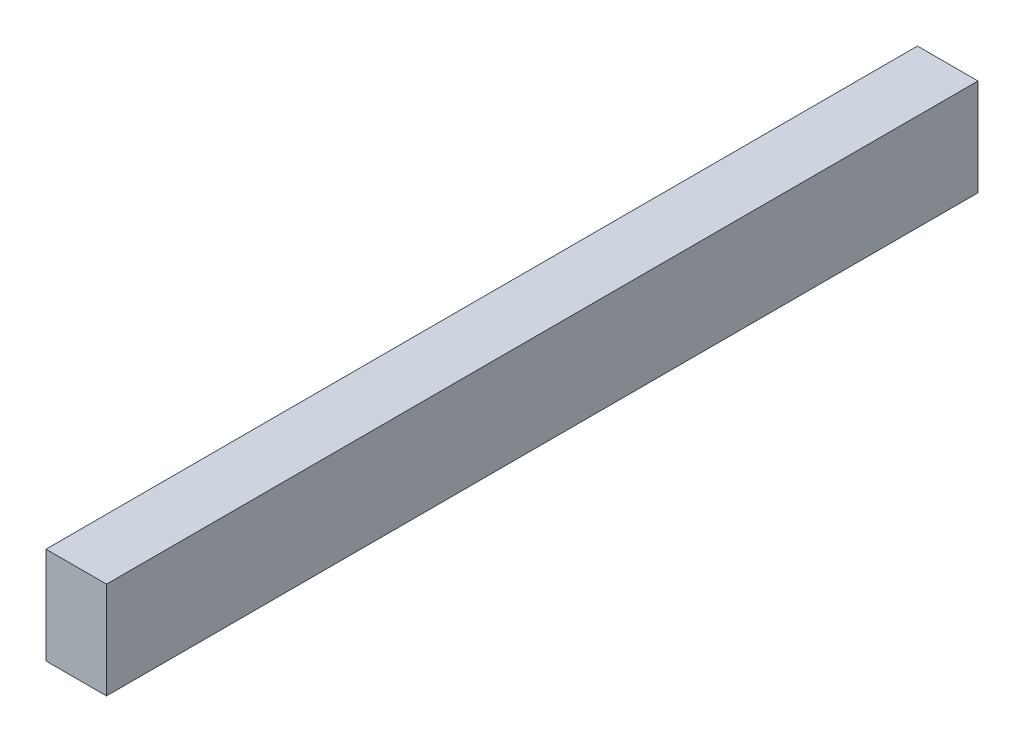
ISO-10303-21;
HEADER;
FILE_DESCRIPTION(('STEP AP214'),'2;1');
FILE_NAME('part.step','',(''),(''),'','','');
FILE_SCHEMA(('AUTOMOTIVE_DESIGN { 1 0 10303 214 1 1 1 1 }'));
ENDSEC;
DATA;
#1=APPLICATION_CONTEXT('core data for automotive mechanical design processes');
#2=APPLICATION_PROTOCOL_DEFINITION('international standard','automotive_design',2000,#1);
#3=PRODUCT_CONTEXT('',#1,'mechanical');
#4=PRODUCT('Part','Part','',(#3));
#5=PRODUCT_RELATED_PRODUCT_CATEGORY('part','',(#4));
#6=PRODUCT_DEFINITION_FORMATION('','',#4);
#7=PRODUCT_DEFINITION_CONTEXT('part definition',#1,'design');
#8=PRODUCT_DEFINITION('design','',#6,#7);
#9=PRODUCT_DEFINITION_SHAPE('','',#8);
#10=(LENGTH_UNIT() NAMED_UNIT(*) SI_UNIT(.MILLI.,.METRE.));
#11=(NAMED_UNIT(*) PLANE_ANGLE_UNIT() SI_UNIT($,.RADIAN.));
#12=(NAMED_UNIT(*) SI_UNIT($,.STERADIAN.) SOLID_ANGLE_UNIT());
#13=UNCERTAINTY_MEASURE_WITH_UNIT(LENGTH_MEASURE(1.E-05),#10,'distance_accuracy_value','');
#14=(GEOMETRIC_REPRESENTATION_CONTEXT(3) GLOBAL_UNCERTAINTY_ASSIGNED_CONTEXT((#13)) GLOBAL_UNIT_ASSIGNED_CONTEXT((#10,
#11,#12)) REPRESENTATION_CONTEXT('',''));
#15=CARTESIAN_POINT('',(0.,0.,0.));
#16=DIRECTION('',(0.,0.,1.));
#17=DIRECTION('',(1.,0.,0.));
#18=AXIS2_PLACEMENT_3D('',#15,#16,#17);
#19=CARTESIAN_POINT('',(0.,0.,360.));
#20=DIRECTION('',(1.,0.,0.));
#21=DIRECTION('',(0.,0.,-1.));
#22=AXIS2_PLACEMENT_3D('',#19,#20,#21);
#23=PLANE('',#22);
#24=DIRECTION('',(0.,-1.,0.));
#25=VECTOR('',#24,1.);
#26=CARTESIAN_POINT('',(0.,0.,0.));
#27=LINE('',#26,#25);
#28=CARTESIAN_POINT('',(0.,40.,0.));
#29=VERTEX_POINT('',#28);
#30=CARTESIAN_POINT('',(0.,0.,0.));
#31=VERTEX_POINT('',#30);
#32=EDGE_CURVE('E96',#29,#31,#27,.T.);
#33=ORIENTED_EDGE('',*,*,#32,.T.);
#34=DIRECTION('',(0.,0.,-1.));
#35=VECTOR('',#34,1.);
#36=CARTESIAN_POINT('',(0.,0.,360.));
#37=LINE('',#36,#35);
#38=CARTESIAN_POINT('',(0.,0.,360.));
#39=VERTEX_POINT('',#38);
#40=EDGE_CURVE('E11',#39,#31,#37,.T.);
#41=ORIENTED_EDGE('',*,*,#40,.F.);
#42=DIRECTION('',(0.,-1.,0.));
#43=VECTOR('',#42,1.);
#44=CARTESIAN_POINT('',(0.,0.,360.));
#45=LINE('',#44,#43);
#46=CARTESIAN_POINT('',(0.,40.,360.));
#47=VERTEX_POINT('',#46);
#48=EDGE_CURVE('E84',#47,#39,#45,.T.);
#49=ORIENTED_EDGE('',*,*,#48,.F.);
#50=DIRECTION('',(0.,0.,-1.));
#51=VECTOR('',#50,1.);
#52=CARTESIAN_POINT('',(0.,40.,360.));
#53=LINE('',#52,#51);
#54=EDGE_CURVE('E92',#47,#29,#53,.T.);
#55=ORIENTED_EDGE('',*,*,#54,.T.);
#56=EDGE_LOOP('',(#33,#41,#49,#55));
#57=FACE_BOUND('',#56,.T.);
#58=ADVANCED_FACE('F33',(#57),#23,.F.);
#59=CARTESIAN_POINT('',(0.,0.,360.));
#60=DIRECTION('',(0.,1.,0.));
#61=DIRECTION('',(0.,0.,1.));
#62=AXIS2_PLACEMENT_3D('',#59,#60,#61);
#63=PLANE('',#62);
#64=DIRECTION('',(1.,0.,0.));
#65=VECTOR('',#64,1.);
#66=CARTESIAN_POINT('',(0.,0.,0.));
#67=LINE('',#66,#65);
#68=CARTESIAN_POINT('',(25.,0.,0.));
#69=VERTEX_POINT('',#68);
#70=EDGE_CURVE('E88',#31,#69,#67,.T.);
#71=ORIENTED_EDGE('',*,*,#70,.T.);
#72=DIRECTION('',(0.,0.,-1.));
#73=VECTOR('',#72,1.);
#74=CARTESIAN_POINT('',(25.,0.,360.));
#75=LINE('',#74,#73);
#76=CARTESIAN_POINT('',(25.,0.,360.));
#77=VERTEX_POINT('',#76);
#78=EDGE_CURVE('E41',#77,#69,#75,.T.);
#79=ORIENTED_EDGE('',*,*,#78,.F.);
#80=DIRECTION('',(1.,0.,0.));
#81=VECTOR('',#80,1.);
#82=CARTESIAN_POINT('',(0.,0.,360.));
#83=LINE('',#82,#81);
#84=EDGE_CURVE('E79',#39,#77,#83,.T.);
#85=ORIENTED_EDGE('',*,*,#84,.F.);
#86=ORIENTED_EDGE('',*,*,#40,.T.);
#87=EDGE_LOOP('',(#71,#79,#85,#86));
#88=FACE_BOUND('',#87,.T.);
#89=ADVANCED_FACE('F87',(#88),#63,.F.);
#90=CARTESIAN_POINT('',(25.,0.,360.));
#91=DIRECTION('',(-1.,0.,0.));
#92=DIRECTION('',(0.,0.,1.));
#93=AXIS2_PLACEMENT_3D('',#90,#91,#92);
#94=PLANE('',#93);
#95=DIRECTION('',(0.,1.,0.));
#96=VECTOR('',#95,1.);
#97=CARTESIAN_POINT('',(25.,0.,0.));
#98=LINE('',#97,#96);
#99=CARTESIAN_POINT('',(25.,40.,0.));
#100=VERTEX_POINT('',#99);
#101=EDGE_CURVE('E66',#69,#100,#98,.T.);
#102=ORIENTED_EDGE('',*,*,#101,.T.);
#103=DIRECTION('',(0.,0.,-1.));
#104=VECTOR('',#103,1.);
#105=CARTESIAN_POINT('',(25.,40.,360.));
#106=LINE('',#105,#104);
#107=CARTESIAN_POINT('',(25.,40.,360.));
#108=VERTEX_POINT('',#107);
#109=EDGE_CURVE('E89',#108,#100,#106,.T.);
#110=ORIENTED_EDGE('',*,*,#109,.F.);
#111=DIRECTION('',(0.,1.,0.));
#112=VECTOR('',#111,1.);
#113=CARTESIAN_POINT('',(25.,0.,360.));
#114=LINE('',#113,#112);
#115=EDGE_CURVE('E82',#77,#108,#114,.T.);
#116=ORIENTED_EDGE('',*,*,#115,.F.);
#117=ORIENTED_EDGE('',*,*,#78,.T.);
#118=EDGE_LOOP('',(#102,#110,#116,#117));
#119=FACE_BOUND('',#118,.T.);
#120=ADVANCED_FACE('F90',(#119),#94,.F.);
#121=CARTESIAN_POINT('',(0.,40.,360.));
#122=DIRECTION('',(0.,-1.,0.));
#123=DIRECTION('',(0.,0.,-1.));
#124=AXIS2_PLACEMENT_3D('',#121,#122,#123);
#125=PLANE('',#124);
#126=DIRECTION('',(-1.,0.,0.));
#127=VECTOR('',#126,1.);
#128=CARTESIAN_POINT('',(0.,40.,0.));
#129=LINE('',#128,#127);
#130=EDGE_CURVE('E72',#100,#29,#129,.T.);
#131=ORIENTED_EDGE('',*,*,#130,.T.);
#132=ORIENTED_EDGE('',*,*,#54,.F.);
#133=DIRECTION('',(-1.,0.,0.));
#134=VECTOR('',#133,1.);
#135=CARTESIAN_POINT('',(0.,40.,360.));
#136=LINE('',#135,#134);
#137=EDGE_CURVE('E49',#108,#47,#136,.T.);
#138=ORIENTED_EDGE('',*,*,#137,.F.);
#139=ORIENTED_EDGE('',*,*,#109,.T.);
#140=EDGE_LOOP('',(#131,#132,#138,#139));
#141=FACE_BOUND('',#140,.T.);
#142=ADVANCED_FACE('F103',(#141),#125,.F.);
#143=CARTESIAN_POINT('',(0.,0.,360.));
#144=DIRECTION('',(0.,0.,-1.));
#145=DIRECTION('',(-1.,0.,0.));
#146=AXIS2_PLACEMENT_3D('',#143,#144,#145);
#147=PLANE('',#146);
#148=ORIENTED_EDGE('',*,*,#48,.T.);
#149=ORIENTED_EDGE('',*,*,#84,.T.);
#150=ORIENTED_EDGE('',*,*,#115,.T.);
#151=ORIENTED_EDGE('',*,*,#137,.T.);
#152=EDGE_LOOP('',(#148,#149,#150,#151));
#153=FACE_BOUND('',#152,.T.);
#154=ADVANCED_FACE('F80',(#153),#147,.F.);
#155=CARTESIAN_POINT('',(0.,0.,0.));
#156=DIRECTION('',(0.,0.,-1.));
#157=DIRECTION('',(-1.,0.,0.));
#158=AXIS2_PLACEMENT_3D('',#155,#156,#157);
#159=PLANE('',#158);
#160=ORIENTED_EDGE('',*,*,#32,.F.);
#161=ORIENTED_EDGE('',*,*,#130,.F.);
#162=ORIENTED_EDGE('',*,*,#101,.F.);
#163=ORIENTED_EDGE('',*,*,#70,.F.);
#164=EDGE_LOOP('',(#160,#161,#162,#163));
#165=FACE_BOUND('',#164,.T.);
#166=ADVANCED_FACE('F106',(#165),#159,.T.);
#167=CLOSED_SHELL('',(#58,#89,#120,#142,#154,#166));
#168=MANIFOLD_SOLID_BREP('B2',#167);
#169=ADVANCED_BREP_SHAPE_REPRESENTATION('',(#18,#168),#14);
#170=SHAPE_DEFINITION_REPRESENTATION(#9,#169);
ENDSEC;
END-ISO-10303-21;
